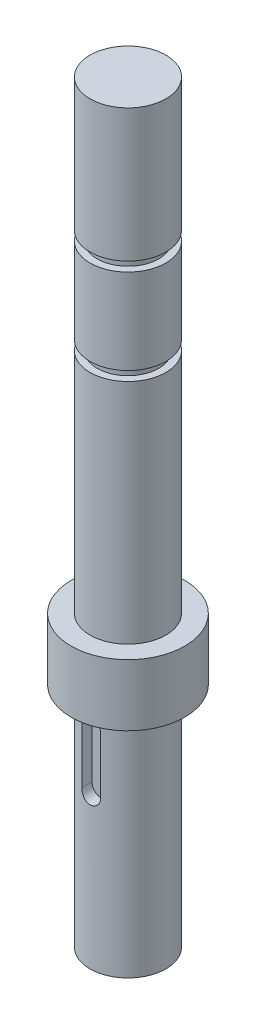
ISO-10303-21;
HEADER;
FILE_DESCRIPTION(('STEP AP214'),'2;1');
FILE_NAME('part.step','',(''),(''),'','','');
FILE_SCHEMA(('AUTOMOTIVE_DESIGN { 1 0 10303 214 1 1 1 1 }'));
ENDSEC;
DATA;
#1=APPLICATION_CONTEXT('core data for automotive mechanical design processes');
#2=APPLICATION_PROTOCOL_DEFINITION('international standard','automotive_design',2000,#1);
#3=PRODUCT_CONTEXT('',#1,'mechanical');
#4=PRODUCT('Part','Part','',(#3));
#5=PRODUCT_RELATED_PRODUCT_CATEGORY('part','',(#4));
#6=PRODUCT_DEFINITION_FORMATION('','',#4);
#7=PRODUCT_DEFINITION_CONTEXT('part definition',#1,'design');
#8=PRODUCT_DEFINITION('design','',#6,#7);
#9=PRODUCT_DEFINITION_SHAPE('','',#8);
#10=(LENGTH_UNIT() NAMED_UNIT(*) SI_UNIT(.MILLI.,.METRE.));
#11=(NAMED_UNIT(*) PLANE_ANGLE_UNIT() SI_UNIT($,.RADIAN.));
#12=(NAMED_UNIT(*) SI_UNIT($,.STERADIAN.) SOLID_ANGLE_UNIT());
#13=UNCERTAINTY_MEASURE_WITH_UNIT(LENGTH_MEASURE(1.E-05),#10,'distance_accuracy_value','');
#14=(GEOMETRIC_REPRESENTATION_CONTEXT(3) GLOBAL_UNCERTAINTY_ASSIGNED_CONTEXT((#13)) GLOBAL_UNIT_ASSIGNED_CONTEXT((#10,
#11,#12)) REPRESENTATION_CONTEXT('',''));
#15=CARTESIAN_POINT('',(0.,0.,0.));
#16=DIRECTION('',(0.,0.,1.));
#17=DIRECTION('',(1.,0.,0.));
#18=AXIS2_PLACEMENT_3D('',#15,#16,#17);
#19=CARTESIAN_POINT('',(6.0042,79.5028,6.004203548781));
#20=DIRECTION('',(0.,1.,0.));
#21=DIRECTION('',(0.,0.,1.));
#22=AXIS2_PLACEMENT_3D('',#19,#20,#21);
#23=PLANE('',#22);
#24=CARTESIAN_POINT('',(6.0042,79.5028,6.004203548781));
#25=DIRECTION('',(0.,1.,0.));
#26=DIRECTION('',(0.,0.,1.));
#27=AXIS2_PLACEMENT_3D('',#24,#25,#26);
#28=CIRCLE('',#27,4.);
#29=CARTESIAN_POINT('',(6.0042,79.5028,10.004203548781));
#30=VERTEX_POINT('',#29);
#31=EDGE_CURVE('E19',#30,#30,#28,.F.);
#32=ORIENTED_EDGE('',*,*,#31,.F.);
#33=EDGE_LOOP('',(#32));
#34=FACE_BOUND('',#33,.T.);
#35=ADVANCED_FACE('F16',(#34),#23,.T.);
#36=CARTESIAN_POINT('',(6.0042,65.5028,6.004203548781));
#37=DIRECTION('',(0.,1.,0.));
#38=DIRECTION('',(0.,0.,1.));
#39=AXIS2_PLACEMENT_3D('',#36,#37,#38);
#40=CYLINDRICAL_SURFACE('',#39,4.);
#41=CARTESIAN_POINT('',(6.0042,65.5028,6.004203548781));
#42=DIRECTION('',(0.,1.,0.));
#43=DIRECTION('',(0.,0.,1.));
#44=AXIS2_PLACEMENT_3D('',#41,#42,#43);
#45=CIRCLE('',#44,4.);
#46=CARTESIAN_POINT('',(6.0042,65.5028,10.004203548781));
#47=VERTEX_POINT('',#46);
#48=EDGE_CURVE('E198',#47,#47,#45,.T.);
#49=ORIENTED_EDGE('',*,*,#48,.T.);
#50=EDGE_LOOP('',(#49));
#51=FACE_BOUND('',#50,.T.);
#52=ORIENTED_EDGE('',*,*,#31,.T.);
#53=EDGE_LOOP('',(#52));
#54=FACE_BOUND('',#53,.T.);
#55=ADVANCED_FACE('F203',(#51,#54),#40,.T.);
#56=CARTESIAN_POINT('',(6.0042,65.5028,6.004203548781));
#57=DIRECTION('',(0.,1.,0.));
#58=DIRECTION('',(0.,0.,1.));
#59=AXIS2_PLACEMENT_3D('',#56,#57,#58);
#60=PLANE('',#59);
#61=CARTESIAN_POINT('',(6.0042,65.5028,6.004203548781));
#62=DIRECTION('',(0.,1.,0.));
#63=DIRECTION('',(0.,0.,1.));
#64=AXIS2_PLACEMENT_3D('',#61,#62,#63);
#65=CIRCLE('',#64,3.25);
#66=CARTESIAN_POINT('',(6.0042,65.5028,9.254203548781));
#67=VERTEX_POINT('',#66);
#68=EDGE_CURVE('E195',#67,#67,#65,.F.);
#69=ORIENTED_EDGE('',*,*,#68,.F.);
#70=EDGE_LOOP('',(#69));
#71=FACE_BOUND('',#70,.T.);
#72=ORIENTED_EDGE('',*,*,#48,.F.);
#73=EDGE_LOOP('',(#72));
#74=FACE_BOUND('',#73,.T.);
#75=ADVANCED_FACE('F209',(#71,#74),#60,.F.);
#76=CARTESIAN_POINT('',(6.0042,8.0028,6.004203548781));
#77=DIRECTION('',(0.,1.,0.));
#78=DIRECTION('',(0.,0.,1.));
#79=AXIS2_PLACEMENT_3D('',#76,#77,#78);
#80=PLANE('',#79);
#81=CARTESIAN_POINT('',(6.0042,8.0028,6.004203548781));
#82=DIRECTION('',(0.,1.,0.));
#83=DIRECTION('',(0.,0.,1.));
#84=AXIS2_PLACEMENT_3D('',#81,#82,#83);
#85=CIRCLE('',#84,1.5);
#86=CARTESIAN_POINT('',(6.0042,8.0028,7.504203548781));
#87=VERTEX_POINT('',#86);
#88=EDGE_CURVE('E192',#87,#87,#85,.F.);
#89=ORIENTED_EDGE('',*,*,#88,.T.);
#90=EDGE_LOOP('',(#89));
#91=FACE_BOUND('',#90,.T.);
#92=ADVANCED_FACE('F214',(#91),#80,.F.);
#93=CARTESIAN_POINT('',(6.0042,64.5028,6.004203548781));
#94=DIRECTION('',(0.,1.,0.));
#95=DIRECTION('',(0.,0.,1.));
#96=AXIS2_PLACEMENT_3D('',#93,#94,#95);
#97=CYLINDRICAL_SURFACE('',#96,3.25);
#98=CARTESIAN_POINT('',(6.0042,64.5028,6.004203548781));
#99=DIRECTION('',(0.,1.,0.));
#100=DIRECTION('',(0.,0.,1.));
#101=AXIS2_PLACEMENT_3D('',#98,#99,#100);
#102=CIRCLE('',#101,3.25);
#103=CARTESIAN_POINT('',(6.0042,64.5028,9.254203548781));
#104=VERTEX_POINT('',#103);
#105=EDGE_CURVE('E189',#104,#104,#102,.F.);
#106=ORIENTED_EDGE('',*,*,#105,.F.);
#107=EDGE_LOOP('',(#106));
#108=FACE_BOUND('',#107,.T.);
#109=ORIENTED_EDGE('',*,*,#68,.T.);
#110=EDGE_LOOP('',(#109));
#111=FACE_BOUND('',#110,.T.);
#112=ADVANCED_FACE('F220',(#108,#111),#97,.T.);
#113=CARTESIAN_POINT('',(6.0042,0.002799999999979,6.004203548781));
#114=DIRECTION('',(0.,1.,0.));
#115=DIRECTION('',(0.,0.,1.));
#116=AXIS2_PLACEMENT_3D('',#113,#114,#115);
#117=CYLINDRICAL_SURFACE('',#116,1.5);
#118=CARTESIAN_POINT('',(6.0042,0.002799999999979,6.004203548781));
#119=DIRECTION('',(0.,1.,0.));
#120=DIRECTION('',(0.,0.,1.));
#121=AXIS2_PLACEMENT_3D('',#118,#119,#120);
#122=CIRCLE('',#121,1.5);
#123=CARTESIAN_POINT('',(6.0042,0.002799999999979,7.504203548781));
#124=VERTEX_POINT('',#123);
#125=EDGE_CURVE('E175',#124,#124,#122,.F.);
#126=ORIENTED_EDGE('',*,*,#125,.T.);
#127=EDGE_LOOP('',(#126));
#128=FACE_BOUND('',#127,.T.);
#129=ORIENTED_EDGE('',*,*,#88,.F.);
#130=EDGE_LOOP('',(#129));
#131=FACE_BOUND('',#130,.T.);
#132=ADVANCED_FACE('F224',(#128,#131),#117,.F.);
#133=CARTESIAN_POINT('',(7.0042,16.0028,8.804203548781));
#134=DIRECTION('',(0.,0.,1.));
#135=DIRECTION('',(1.,0.,0.));
#136=AXIS2_PLACEMENT_3D('',#133,#134,#135);
#137=PLANE('',#136);
#138=DIRECTION('',(0.,1.,0.));
#139=VECTOR('',#138,1.);
#140=CARTESIAN_POINT('',(5.0042,16.0028,8.804203548781));
#141=LINE('',#140,#139);
#142=CARTESIAN_POINT('',(5.0042,22.0028,8.804203548781));
#143=VERTEX_POINT('',#142);
#144=CARTESIAN_POINT('',(5.0042,16.0028,8.804203548781));
#145=VERTEX_POINT('',#144);
#146=EDGE_CURVE('E169',#143,#145,#141,.F.);
#147=ORIENTED_EDGE('',*,*,#146,.T.);
#148=CARTESIAN_POINT('',(6.0042,16.0028,8.804203548781));
#149=DIRECTION('',(0.,0.,1.));
#150=DIRECTION('',(1.,0.,0.));
#151=AXIS2_PLACEMENT_3D('',#148,#149,#150);
#152=CIRCLE('',#151,1.);
#153=CARTESIAN_POINT('',(7.0042,16.0028,8.804203548781));
#154=VERTEX_POINT('',#153);
#155=EDGE_CURVE('E174',#145,#154,#152,.T.);
#156=ORIENTED_EDGE('',*,*,#155,.T.);
#157=DIRECTION('',(0.,1.,0.));
#158=VECTOR('',#157,1.);
#159=CARTESIAN_POINT('',(7.0042,16.0028,8.804203548781));
#160=LINE('',#159,#158);
#161=CARTESIAN_POINT('',(7.0042,22.0028,8.804203548781));
#162=VERTEX_POINT('',#161);
#163=EDGE_CURVE('E172',#162,#154,#160,.F.);
#164=ORIENTED_EDGE('',*,*,#163,.F.);
#165=CARTESIAN_POINT('',(6.0042,22.0028,8.804203548781));
#166=DIRECTION('',(0.,0.,1.));
#167=DIRECTION('',(1.,0.,0.));
#168=AXIS2_PLACEMENT_3D('',#165,#166,#167);
#169=CIRCLE('',#168,1.);
#170=EDGE_CURVE('E54',#162,#143,#169,.T.);
#171=ORIENTED_EDGE('',*,*,#170,.T.);
#172=EDGE_LOOP('',(#147,#156,#164,#171));
#173=FACE_BOUND('',#172,.T.);
#174=ADVANCED_FACE('F181',(#173),#137,.T.);
#175=CARTESIAN_POINT('',(6.0042,64.5028,6.004203548781));
#176=DIRECTION('',(0.,1.,0.));
#177=DIRECTION('',(0.,0.,1.));
#178=AXIS2_PLACEMENT_3D('',#175,#176,#177);
#179=PLANE('',#178);
#180=ORIENTED_EDGE('',*,*,#105,.T.);
#181=EDGE_LOOP('',(#180));
#182=FACE_BOUND('',#181,.T.);
#183=CARTESIAN_POINT('',(6.0042,64.5028,6.004203548781));
#184=DIRECTION('',(0.,1.,0.));
#185=DIRECTION('',(0.,0.,1.));
#186=AXIS2_PLACEMENT_3D('',#183,#184,#185);
#187=CIRCLE('',#186,4.);
#188=CARTESIAN_POINT('',(6.0042,64.5028,10.004203548781));
#189=VERTEX_POINT('',#188);
#190=EDGE_CURVE('E73',#189,#189,#187,.F.);
#191=ORIENTED_EDGE('',*,*,#190,.F.);
#192=EDGE_LOOP('',(#191));
#193=FACE_BOUND('',#192,.T.);
#194=ADVANCED_FACE('F231',(#182,#193),#179,.T.);
#195=CARTESIAN_POINT('',(6.0042,0.002799999999979,6.004203548781));
#196=DIRECTION('',(0.,1.,0.));
#197=DIRECTION('',(0.,0.,1.));
#198=AXIS2_PLACEMENT_3D('',#195,#196,#197);
#199=PLANE('',#198);
#200=ORIENTED_EDGE('',*,*,#125,.F.);
#201=EDGE_LOOP('',(#200));
#202=FACE_BOUND('',#201,.T.);
#203=CARTESIAN_POINT('',(6.0042,0.002799999999979,6.004203548781));
#204=DIRECTION('',(0.,1.,0.));
#205=DIRECTION('',(0.,0.,1.));
#206=AXIS2_PLACEMENT_3D('',#203,#204,#205);
#207=CIRCLE('',#206,4.);
#208=CARTESIAN_POINT('',(6.0042,0.002799999999979,10.004203548781));
#209=VERTEX_POINT('',#208);
#210=EDGE_CURVE('E70',#209,#209,#207,.T.);
#211=ORIENTED_EDGE('',*,*,#210,.F.);
#212=EDGE_LOOP('',(#211));
#213=FACE_BOUND('',#212,.T.);
#214=ADVANCED_FACE('F234',(#202,#213),#199,.F.);
#215=CARTESIAN_POINT('',(7.0042,16.0028,8.804203548781));
#216=DIRECTION('',(-1.,0.,0.));
#217=DIRECTION('',(0.,0.,1.));
#218=AXIS2_PLACEMENT_3D('',#215,#216,#217);
#219=PLANE('',#218);
#220=DIRECTION('',(0.,0.,1.));
#221=VECTOR('',#220,1.);
#222=CARTESIAN_POINT('',(7.0042,16.0028,8.804203548781));
#223=LINE('',#222,#221);
#224=CARTESIAN_POINT('',(7.00420000000003,16.0028,9.8771868949884));
#225=VERTEX_POINT('',#224);
#226=EDGE_CURVE('E65',#154,#225,#223,.T.);
#227=ORIENTED_EDGE('',*,*,#226,.T.);
#228=DIRECTION('',(0.,1.,0.));
#229=VECTOR('',#228,1.);
#230=CARTESIAN_POINT('',(7.0042000000001,0.002799999999979,9.87718689498839));
#231=LINE('',#230,#229);
#232=CARTESIAN_POINT('',(7.00420000000005,22.0028,9.8771868949884));
#233=VERTEX_POINT('',#232);
#234=EDGE_CURVE('E60',#233,#225,#231,.F.);
#235=ORIENTED_EDGE('',*,*,#234,.F.);
#236=DIRECTION('',(0.,0.,1.));
#237=VECTOR('',#236,1.);
#238=CARTESIAN_POINT('',(7.0042,22.0028,8.804203548781));
#239=LINE('',#238,#237);
#240=EDGE_CURVE('E63',#233,#162,#239,.F.);
#241=ORIENTED_EDGE('',*,*,#240,.T.);
#242=ORIENTED_EDGE('',*,*,#163,.T.);
#243=EDGE_LOOP('',(#227,#235,#241,#242));
#244=FACE_BOUND('',#243,.T.);
#245=ADVANCED_FACE('F61',(#244),#219,.T.);
#246=CARTESIAN_POINT('',(6.0042,16.0028,8.804203548781));
#247=DIRECTION('',(0.,0.,1.));
#248=DIRECTION('',(1.,0.,0.));
#249=AXIS2_PLACEMENT_3D('',#246,#247,#248);
#250=CYLINDRICAL_SURFACE('',#249,1.);
#251=ORIENTED_EDGE('',*,*,#155,.F.);
#252=DIRECTION('',(0.,0.,1.));
#253=VECTOR('',#252,1.);
#254=CARTESIAN_POINT('',(5.0042,16.0028,8.804203548781));
#255=LINE('',#254,#253);
#256=CARTESIAN_POINT('',(5.00419999999995,16.0028,9.8771868949884));
#257=VERTEX_POINT('',#256);
#258=EDGE_CURVE('E171',#145,#257,#255,.T.);
#259=ORIENTED_EDGE('',*,*,#258,.T.);
#260=CARTESIAN_POINT('',(7.0042,16.0028,9.87718689498842));
#261=CARTESIAN_POINT('',(7.00420033749611,15.9751370148935,9.87718503458277));
#262=CARTESIAN_POINT('',(7.00305140737537,15.9474877369818,9.87748364827571));
#263=CARTESIAN_POINT('',(6.99847129539575,15.8923959646964,9.87866259652659));
#264=CARTESIAN_POINT('',(6.99504049757268,15.8649534363129,9.87954283319787));
#265=CARTESIAN_POINT('',(6.98137523938253,15.7833468267912,9.88302065850154));
#266=CARTESIAN_POINT('',(6.96776769517249,15.7297435315178,9.88645558026909));
#267=CARTESIAN_POINT('',(6.931998076248,15.625675326218,9.89515777466103));
#268=CARTESIAN_POINT('',(6.90983680542384,15.5752101217871,9.9004248750903));
#269=CARTESIAN_POINT('',(6.85761537802587,15.4786885513527,9.91219489350039));
#270=CARTESIAN_POINT('',(6.82755310335693,15.432633372109,9.91869814273747));
#271=CARTESIAN_POINT('',(6.75968447182807,15.3452561180939,9.93236617276125));
#272=CARTESIAN_POINT('',(6.72173726878398,15.3040451137545,9.93954145907016));
#273=CARTESIAN_POINT('',(6.63947578051623,15.2284979105173,9.95365459274293));
#274=CARTESIAN_POINT('',(6.59516047947883,15.1941628105321,9.96059240200637));
#275=CARTESIAN_POINT('',(6.50065689940169,15.1328889983814,9.97356537161348));
#276=CARTESIAN_POINT('',(6.45039534033447,15.106060104016,9.9795865955983));
#277=CARTESIAN_POINT('',(6.34590259084292,15.0612752658033,9.98992701128689));
#278=CARTESIAN_POINT('',(6.29167218408301,15.0433175757002,9.99424653792801));
#279=CARTESIAN_POINT('',(6.18194410852516,15.0171410072226,10.0006225488323));
#280=CARTESIAN_POINT('',(6.12649432200286,15.0087323275772,10.002723077794));
#281=CARTESIAN_POINT('',(6.01493277568168,15.0012966284567,10.0045779302892));
#282=CARTESIAN_POINT('',(5.95882109997129,15.0022684298077,10.0043325487154));
#283=CARTESIAN_POINT('',(5.8488475070279,15.0134299636855,10.0015559224384));
#284=CARTESIAN_POINT('',(5.79496329826014,15.0234146165995,9.99907553555461));
#285=CARTESIAN_POINT('',(5.68966128891566,15.0519886791827,9.99216685514596));
#286=CARTESIAN_POINT('',(5.63824359757601,15.0705784695686,9.98773847543656));
#287=CARTESIAN_POINT('',(5.53879271397546,15.1160012806707,9.97735352639898));
#288=CARTESIAN_POINT('',(5.49079437039775,15.1429073942328,9.97138348705655));
#289=CARTESIAN_POINT('',(5.39992336876999,15.2041431298335,9.95856300420019));
#290=CARTESIAN_POINT('',(5.35705148443771,15.2384738702532,9.95171242811298));
#291=CARTESIAN_POINT('',(5.27643061029151,15.3146789120813,9.93765920900965));
#292=CARTESIAN_POINT('',(5.23885089694587,15.3567316365398,9.93045205355785));
#293=CARTESIAN_POINT('',(5.17123042481376,15.4466298669277,9.91666523162106));
#294=CARTESIAN_POINT('',(5.14119172975494,15.4944769532836,9.91008573721093));
#295=CARTESIAN_POINT('',(5.08939529071404,15.5949455978238,9.89828168464425));
#296=CARTESIAN_POINT('',(5.06768298211273,15.6475914648961,9.89306460887237));
#297=CARTESIAN_POINT('',(5.03349764815017,15.7559169284183,9.88467413685155));
#298=CARTESIAN_POINT('',(5.02101081078787,15.8115918551498,9.88149768639535));
#299=CARTESIAN_POINT('',(5.01029536484906,15.8902573807589,9.87875645559624));
#300=CARTESIAN_POINT('',(5.00800920903329,15.9127197032132,9.8781687798896));
#301=CARTESIAN_POINT('',(5.00496324230261,15.9577177899093,9.87738417367075));
#302=CARTESIAN_POINT('',(5.00420096190396,15.9802533759553,9.87718661097561));
#303=CARTESIAN_POINT('',(5.0042,16.0028,9.87718689498842));
#304=B_SPLINE_CURVE_WITH_KNOTS('',3,(#260,#261,#262,#263,#264,#265,#266,#267,#268,#269,#270,
#271,#272,#273,#274,#275,#276,#277,#278,#279,#280,#281,#282,#283,#284,#285,#286,#287,#288,#289,
#290,#291,#292,#293,#294,#295,#296,#297,#298,#299,#300,#301,#302,#303),.UNSPECIFIED.,.F.,.F.,(4,
2,2,2,2,2,2,2,2,2,2,2,2,2,2,2,2,2,2,2,2,4),(0.,0.0829365303397693,0.16585910608465,
0.331229963080318,0.496585282091499,0.66198497472675,0.830641897427972,0.999325753539192,
1.17036187098235,1.34136430732424,1.50890481515325,1.67642426256639,1.84022545479276,
2.00403389475838,2.16932509450376,2.33464120964329,2.50441429534542,2.67423379180967,
2.84496720161068,3.01544447539986,3.08315848722648,3.15076267731671),.UNSPECIFIED.);
#305=EDGE_CURVE('E69',#225,#257,#304,.T.);
#306=ORIENTED_EDGE('',*,*,#305,.F.);
#307=ORIENTED_EDGE('',*,*,#226,.F.);
#308=EDGE_LOOP('',(#251,#259,#306,#307));
#309=FACE_BOUND('',#308,.T.);
#310=ADVANCED_FACE('F183',(#309),#250,.F.);
#311=CARTESIAN_POINT('',(5.0042,16.0028,8.804203548781));
#312=DIRECTION('',(-1.,0.,0.));
#313=DIRECTION('',(0.,0.,1.));
#314=AXIS2_PLACEMENT_3D('',#311,#312,#313);
#315=PLANE('',#314);
#316=ORIENTED_EDGE('',*,*,#258,.F.);
#317=ORIENTED_EDGE('',*,*,#146,.F.);
#318=DIRECTION('',(0.,0.,1.));
#319=VECTOR('',#318,1.);
#320=CARTESIAN_POINT('',(5.0042,22.0028,8.804203548781));
#321=LINE('',#320,#319);
#322=CARTESIAN_POINT('',(5.00419999999998,22.0028,9.8771868949884));
#323=VERTEX_POINT('',#322);
#324=EDGE_CURVE('E74',#143,#323,#321,.T.);
#325=ORIENTED_EDGE('',*,*,#324,.T.);
#326=DIRECTION('',(0.,1.,0.));
#327=VECTOR('',#326,1.);
#328=CARTESIAN_POINT('',(5.0041999999999,0.002799999999979,9.87718689498839));
#329=LINE('',#328,#327);
#330=EDGE_CURVE('E80',#257,#323,#329,.T.);
#331=ORIENTED_EDGE('',*,*,#330,.F.);
#332=EDGE_LOOP('',(#316,#317,#325,#331));
#333=FACE_BOUND('',#332,.T.);
#334=ADVANCED_FACE('F118',(#333),#315,.F.);
#335=CARTESIAN_POINT('',(6.0042,22.0028,8.804203548781));
#336=DIRECTION('',(0.,0.,1.));
#337=DIRECTION('',(1.,0.,0.));
#338=AXIS2_PLACEMENT_3D('',#335,#336,#337);
#339=CYLINDRICAL_SURFACE('',#338,1.);
#340=CARTESIAN_POINT('',(5.0042,22.0028,9.87718689498842));
#341=CARTESIAN_POINT('',(5.00419966316718,22.0304629618862,9.87718503456728));
#342=CARTESIAN_POINT('',(5.00534859102648,22.0581122166168,9.87748364776614));
#343=CARTESIAN_POINT('',(5.00992869469143,22.1132039432582,9.87866259407498));
#344=CARTESIAN_POINT('',(5.01335948647907,22.1406464491771,9.87954282930284));
#345=CARTESIAN_POINT('',(5.02702473915658,22.2222530833432,9.88302065271826));
#346=CARTESIAN_POINT('',(5.04063229631471,22.2758564246123,9.88645557635106));
#347=CARTESIAN_POINT('',(5.0764022333358,22.379925593587,9.89515785182482));
#348=CARTESIAN_POINT('',(5.09856395332472,22.4303916629555,9.9004250623188));
#349=CARTESIAN_POINT('',(5.15078571492093,22.5269130864299,9.91219512364839));
#350=CARTESIAN_POINT('',(5.18084759570548,22.5729674100591,9.91869826211342));
#351=CARTESIAN_POINT('',(5.24871202075207,22.6603394864378,9.93236548823139));
#352=CARTESIAN_POINT('',(5.28665479853134,22.7015466452781,9.9395400362693));
#353=CARTESIAN_POINT('',(5.36891577247322,22.777095287631,9.95365320524512));
#354=CARTESIAN_POINT('',(5.41323624728346,22.8114343067441,9.96059174075942));
#355=CARTESIAN_POINT('',(5.50776564673758,22.8727263913366,9.97356868158801));
#356=CARTESIAN_POINT('',(5.55804996487975,22.8995663594361,9.97959273627388));
#357=CARTESIAN_POINT('',(5.6625576836156,22.9443435234846,9.98993132068595));
#358=CARTESIAN_POINT('',(5.71677627294771,22.9622913901323,9.99424789815803));
#359=CARTESIAN_POINT('',(5.81008826437314,22.9845561327113,9.99967246598365));
#360=CARTESIAN_POINT('',(5.84856708197981,22.9913857933547,10.0013628277677));
#361=CARTESIAN_POINT('',(5.9260919972219,23.0005085408135,10.0036288646075));
#362=CARTESIAN_POINT('',(5.9651380865781,23.0028016937716,10.0042045559152));
#363=CARTESIAN_POINT('',(6.05943174598339,23.002797605085,10.0042021247396));
#364=CARTESIAN_POINT('',(6.11469512847884,22.9982072017814,10.0030477272753));
#365=CARTESIAN_POINT('',(6.22365229923442,22.9799887284744,9.99855239375073));
#366=CARTESIAN_POINT('',(6.27734454072826,22.9663520456883,9.99520937398656));
#367=CARTESIAN_POINT('',(6.3815482160312,22.9305065776784,9.98670756403239));
#368=CARTESIAN_POINT('',(6.43206388192616,22.90830949133,9.98155125277873));
#369=CARTESIAN_POINT('',(6.52865098267687,22.8560106110736,9.96997213492019));
#370=CARTESIAN_POINT('',(6.57472253053142,22.825909018223,9.9635493605298));
#371=CARTESIAN_POINT('',(6.66206687105727,22.7580003629654,9.94998646608151));
#372=CARTESIAN_POINT('',(6.70323514890937,22.7200610821916,9.94283527554662));
#373=CARTESIAN_POINT('',(6.77869776276006,22.6378335448416,9.92869465964387));
#374=CARTESIAN_POINT('',(6.81299100431842,22.59354427933,9.921705260188));
#375=CARTESIAN_POINT('',(6.87422661756465,22.4990571540367,9.90856681422561));
#376=CARTESIAN_POINT('',(6.90104989205056,22.4487800204073,9.90243208579172));
#377=CARTESIAN_POINT('',(6.94580949320265,22.3442633719414,9.89186398371668));
#378=CARTESIAN_POINT('',(6.96375249227916,22.2900268673446,9.88742933324717));
#379=CARTESIAN_POINT('',(6.98599305738855,22.1967162001483,9.88185366617236));
#380=CARTESIAN_POINT('',(6.99281002487698,22.1582596460299,9.88011486652224));
#381=CARTESIAN_POINT('',(7.00191633208278,22.0808089785749,9.87777657691937));
#382=CARTESIAN_POINT('',(7.00420893261029,22.0418152728012,9.87717626644477));
#383=CARTESIAN_POINT('',(7.0042,22.0028,9.87718689498842));
#384=B_SPLINE_CURVE_WITH_KNOTS('',3,(#340,#341,#342,#343,#344,#345,#346,#347,#348,#349,#350,
#351,#352,#353,#354,#355,#356,#357,#358,#359,#360,#361,#362,#363,#364,#365,#366,#367,#368,#369,
#370,#371,#372,#373,#374,#375,#376,#377,#378,#379,#380,#381,#382,#383),.UNSPECIFIED.,.F.,.F.,(4,
2,2,2,2,2,2,2,2,2,2,2,2,2,2,2,2,2,2,2,2,4),(0.,0.0829364608197381,0.165858967679134,
0.331229962709977,0.496588203456513,0.661984974171246,0.830625162094538,0.99932575271157,
1.17044795789403,1.34136431261153,1.45844938979968,1.57553275986411,1.74108325106591,
1.9067915862414,2.07227425793989,2.23775272086784,2.40629176845251,2.57485762457941,
2.74597444954042,2.91696250578417,3.03398040676347,3.15091393953944),.UNSPECIFIED.);
#385=EDGE_CURVE('E34',#323,#233,#384,.T.);
#386=ORIENTED_EDGE('',*,*,#385,.F.);
#387=ORIENTED_EDGE('',*,*,#324,.F.);
#388=ORIENTED_EDGE('',*,*,#170,.F.);
#389=ORIENTED_EDGE('',*,*,#240,.F.);
#390=EDGE_LOOP('',(#386,#387,#388,#389));
#391=FACE_BOUND('',#390,.T.);
#392=ADVANCED_FACE('F72',(#391),#339,.F.);
#393=CARTESIAN_POINT('',(6.0042,55.5028,6.004203548781));
#394=DIRECTION('',(0.,1.,0.));
#395=DIRECTION('',(0.,0.,1.));
#396=AXIS2_PLACEMENT_3D('',#393,#394,#395);
#397=CYLINDRICAL_SURFACE('',#396,4.);
#398=CARTESIAN_POINT('',(6.0042,55.5028,6.004203548781));
#399=DIRECTION('',(0.,1.,0.));
#400=DIRECTION('',(0.,0.,1.));
#401=AXIS2_PLACEMENT_3D('',#398,#399,#400);
#402=CIRCLE('',#401,4.);
#403=CARTESIAN_POINT('',(6.0042,55.5028,10.004203548781));
#404=VERTEX_POINT('',#403);
#405=EDGE_CURVE('E81',#404,#404,#402,.T.);
#406=ORIENTED_EDGE('',*,*,#405,.T.);
#407=EDGE_LOOP('',(#406));
#408=FACE_BOUND('',#407,.T.);
#409=ORIENTED_EDGE('',*,*,#190,.T.);
#410=EDGE_LOOP('',(#409));
#411=FACE_BOUND('',#410,.T.);
#412=ADVANCED_FACE('F108',(#408,#411),#397,.T.);
#413=CARTESIAN_POINT('',(6.0042,0.002799999999979,6.004203548781));
#414=DIRECTION('',(0.,1.,0.));
#415=DIRECTION('',(0.,0.,1.));
#416=AXIS2_PLACEMENT_3D('',#413,#414,#415);
#417=CYLINDRICAL_SURFACE('',#416,4.);
#418=CARTESIAN_POINT('',(6.0042,24.0028,6.004203548781));
#419=DIRECTION('',(0.,1.,0.));
#420=DIRECTION('',(0.,0.,1.));
#421=AXIS2_PLACEMENT_3D('',#418,#419,#420);
#422=CIRCLE('',#421,4.);
#423=CARTESIAN_POINT('',(6.0042,24.0028,10.004203548781));
#424=VERTEX_POINT('',#423);
#425=EDGE_CURVE('E84',#424,#424,#422,.F.);
#426=ORIENTED_EDGE('',*,*,#425,.T.);
#427=EDGE_LOOP('',(#426));
#428=FACE_BOUND('',#427,.T.);
#429=ORIENTED_EDGE('',*,*,#330,.T.);
#430=ORIENTED_EDGE('',*,*,#385,.T.);
#431=ORIENTED_EDGE('',*,*,#234,.T.);
#432=ORIENTED_EDGE('',*,*,#305,.T.);
#433=EDGE_LOOP('',(#429,#430,#431,#432));
#434=FACE_BOUND('',#433,.T.);
#435=ORIENTED_EDGE('',*,*,#210,.T.);
#436=EDGE_LOOP('',(#435));
#437=FACE_BOUND('',#436,.T.);
#438=ADVANCED_FACE('F77',(#428,#434,#437),#417,.T.);
#439=CARTESIAN_POINT('',(6.0042,55.5028,6.004203548781));
#440=DIRECTION('',(0.,1.,0.));
#441=DIRECTION('',(0.,0.,1.));
#442=AXIS2_PLACEMENT_3D('',#439,#440,#441);
#443=PLANE('',#442);
#444=CARTESIAN_POINT('',(6.0042,55.5028,6.004203548781));
#445=DIRECTION('',(0.,1.,0.));
#446=DIRECTION('',(0.,0.,1.));
#447=AXIS2_PLACEMENT_3D('',#444,#445,#446);
#448=CIRCLE('',#447,3.25);
#449=CARTESIAN_POINT('',(6.0042,55.5028,9.254203548781));
#450=VERTEX_POINT('',#449);
#451=EDGE_CURVE('E157',#450,#450,#448,.F.);
#452=ORIENTED_EDGE('',*,*,#451,.F.);
#453=EDGE_LOOP('',(#452));
#454=FACE_BOUND('',#453,.T.);
#455=ORIENTED_EDGE('',*,*,#405,.F.);
#456=EDGE_LOOP('',(#455));
#457=FACE_BOUND('',#456,.T.);
#458=ADVANCED_FACE('F107',(#454,#457),#443,.F.);
#459=CARTESIAN_POINT('',(6.0042,24.0028,6.004203548781));
#460=DIRECTION('',(0.,1.,0.));
#461=DIRECTION('',(0.,0.,1.));
#462=AXIS2_PLACEMENT_3D('',#459,#460,#461);
#463=PLANE('',#462);
#464=ORIENTED_EDGE('',*,*,#425,.F.);
#465=EDGE_LOOP('',(#464));
#466=FACE_BOUND('',#465,.T.);
#467=CARTESIAN_POINT('',(6.0042,24.0028,6.004203548781));
#468=DIRECTION('',(0.,1.,0.));
#469=DIRECTION('',(0.,0.,1.));
#470=AXIS2_PLACEMENT_3D('',#467,#468,#469);
#471=CIRCLE('',#470,6.);
#472=CARTESIAN_POINT('',(6.0042,24.0028,12.004203548781));
#473=VERTEX_POINT('',#472);
#474=EDGE_CURVE('E155',#473,#473,#471,.T.);
#475=ORIENTED_EDGE('',*,*,#474,.F.);
#476=EDGE_LOOP('',(#475));
#477=FACE_BOUND('',#476,.T.);
#478=ADVANCED_FACE('F142',(#466,#477),#463,.F.);
#479=CARTESIAN_POINT('',(6.0042,54.5028,6.004203548781));
#480=DIRECTION('',(0.,1.,0.));
#481=DIRECTION('',(0.,0.,1.));
#482=AXIS2_PLACEMENT_3D('',#479,#480,#481);
#483=CYLINDRICAL_SURFACE('',#482,3.25);
#484=CARTESIAN_POINT('',(6.0042,54.5028,6.004203548781));
#485=DIRECTION('',(0.,1.,0.));
#486=DIRECTION('',(0.,0.,1.));
#487=AXIS2_PLACEMENT_3D('',#484,#485,#486);
#488=CIRCLE('',#487,3.25);
#489=CARTESIAN_POINT('',(6.0042,54.5028,9.254203548781));
#490=VERTEX_POINT('',#489);
#491=EDGE_CURVE('E156',#490,#490,#488,.F.);
#492=ORIENTED_EDGE('',*,*,#491,.F.);
#493=EDGE_LOOP('',(#492));
#494=FACE_BOUND('',#493,.T.);
#495=ORIENTED_EDGE('',*,*,#451,.T.);
#496=EDGE_LOOP('',(#495));
#497=FACE_BOUND('',#496,.T.);
#498=ADVANCED_FACE('F139',(#494,#497),#483,.T.);
#499=CARTESIAN_POINT('',(6.0042,24.0028,6.004203548781));
#500=DIRECTION('',(0.,1.,0.));
#501=DIRECTION('',(0.,0.,1.));
#502=AXIS2_PLACEMENT_3D('',#499,#500,#501);
#503=CYLINDRICAL_SURFACE('',#502,6.);
#504=ORIENTED_EDGE('',*,*,#474,.T.);
#505=EDGE_LOOP('',(#504));
#506=FACE_BOUND('',#505,.T.);
#507=CARTESIAN_POINT('',(6.0042,30.5028,6.004203548781));
#508=DIRECTION('',(0.,1.,0.));
#509=DIRECTION('',(0.,0.,1.));
#510=AXIS2_PLACEMENT_3D('',#507,#508,#509);
#511=CIRCLE('',#510,6.);
#512=CARTESIAN_POINT('',(6.0042,30.5028,12.004203548781));
#513=VERTEX_POINT('',#512);
#514=EDGE_CURVE('E160',#513,#513,#511,.T.);
#515=ORIENTED_EDGE('',*,*,#514,.F.);
#516=EDGE_LOOP('',(#515));
#517=FACE_BOUND('',#516,.T.);
#518=ADVANCED_FACE('F135',(#506,#517),#503,.T.);
#519=CARTESIAN_POINT('',(6.0042,54.5028,6.004203548781));
#520=DIRECTION('',(0.,1.,0.));
#521=DIRECTION('',(0.,0.,1.));
#522=AXIS2_PLACEMENT_3D('',#519,#520,#521);
#523=PLANE('',#522);
#524=ORIENTED_EDGE('',*,*,#491,.T.);
#525=EDGE_LOOP('',(#524));
#526=FACE_BOUND('',#525,.T.);
#527=CARTESIAN_POINT('',(6.0042,54.5028,6.004203548781));
#528=DIRECTION('',(0.,1.,0.));
#529=DIRECTION('',(0.,0.,1.));
#530=AXIS2_PLACEMENT_3D('',#527,#528,#529);
#531=CIRCLE('',#530,4.);
#532=CARTESIAN_POINT('',(6.0042,54.5028,10.004203548781));
#533=VERTEX_POINT('',#532);
#534=EDGE_CURVE('E25',#533,#533,#531,.F.);
#535=ORIENTED_EDGE('',*,*,#534,.F.);
#536=EDGE_LOOP('',(#535));
#537=FACE_BOUND('',#536,.T.);
#538=ADVANCED_FACE('F128',(#526,#537),#523,.T.);
#539=CARTESIAN_POINT('',(6.0042,30.5028,6.004203548781));
#540=DIRECTION('',(0.,1.,0.));
#541=DIRECTION('',(0.,0.,1.));
#542=AXIS2_PLACEMENT_3D('',#539,#540,#541);
#543=PLANE('',#542);
#544=CARTESIAN_POINT('',(6.0042,30.5028,6.004203548781));
#545=DIRECTION('',(0.,1.,0.));
#546=DIRECTION('',(0.,0.,1.));
#547=AXIS2_PLACEMENT_3D('',#544,#545,#546);
#548=CIRCLE('',#547,4.);
#549=CARTESIAN_POINT('',(6.0042,30.5028,10.004203548781));
#550=VERTEX_POINT('',#549);
#551=EDGE_CURVE('E11',#550,#550,#548,.T.);
#552=ORIENTED_EDGE('',*,*,#551,.F.);
#553=EDGE_LOOP('',(#552));
#554=FACE_BOUND('',#553,.T.);
#555=ORIENTED_EDGE('',*,*,#514,.T.);
#556=EDGE_LOOP('',(#555));
#557=FACE_BOUND('',#556,.T.);
#558=ADVANCED_FACE('F122',(#554,#557),#543,.T.);
#559=CARTESIAN_POINT('',(6.0042,30.5028,6.004203548781));
#560=DIRECTION('',(0.,1.,0.));
#561=DIRECTION('',(0.,0.,1.));
#562=AXIS2_PLACEMENT_3D('',#559,#560,#561);
#563=CYLINDRICAL_SURFACE('',#562,4.);
#564=ORIENTED_EDGE('',*,*,#551,.T.);
#565=EDGE_LOOP('',(#564));
#566=FACE_BOUND('',#565,.T.);
#567=ORIENTED_EDGE('',*,*,#534,.T.);
#568=EDGE_LOOP('',(#567));
#569=FACE_BOUND('',#568,.T.);
#570=ADVANCED_FACE('F120',(#566,#569),#563,.T.);
#571=CLOSED_SHELL('',(#35,#55,#75,#92,#112,#132,#174,#194,#214,#245,#310,#334,#392,#412,#438,
#458,#478,#498,#518,#538,#558,#570));
#572=MANIFOLD_SOLID_BREP('B1',#571);
#573=ADVANCED_BREP_SHAPE_REPRESENTATION('',(#18,#572),#14);
#574=SHAPE_DEFINITION_REPRESENTATION(#9,#573);
ENDSEC;
END-ISO-10303-21;
